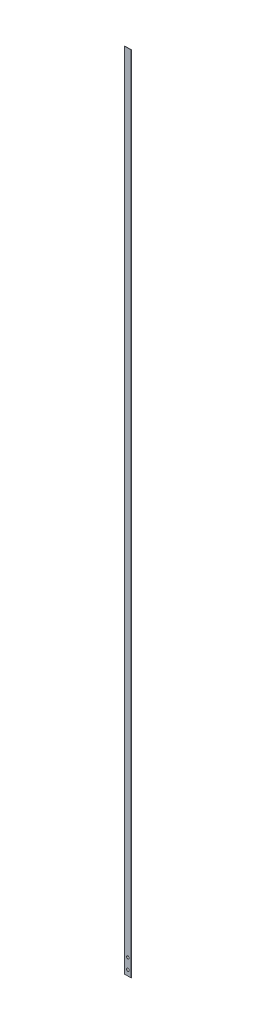
ISO-10303-21;
HEADER;
FILE_DESCRIPTION(('STEP AP214'),'2;1');
FILE_NAME('part.step','',(''),(''),'','','');
FILE_SCHEMA(('AUTOMOTIVE_DESIGN { 1 0 10303 214 1 1 1 1 }'));
ENDSEC;
DATA;
#1=APPLICATION_CONTEXT('core data for automotive mechanical design processes');
#2=APPLICATION_PROTOCOL_DEFINITION('international standard','automotive_design',2000,#1);
#3=PRODUCT_CONTEXT('',#1,'mechanical');
#4=PRODUCT('Part','Part','',(#3));
#5=PRODUCT_RELATED_PRODUCT_CATEGORY('part','',(#4));
#6=PRODUCT_DEFINITION_FORMATION('','',#4);
#7=PRODUCT_DEFINITION_CONTEXT('part definition',#1,'design');
#8=PRODUCT_DEFINITION('design','',#6,#7);
#9=PRODUCT_DEFINITION_SHAPE('','',#8);
#10=(LENGTH_UNIT() NAMED_UNIT(*) SI_UNIT(.MILLI.,.METRE.));
#11=(NAMED_UNIT(*) PLANE_ANGLE_UNIT() SI_UNIT($,.RADIAN.));
#12=(NAMED_UNIT(*) SI_UNIT($,.STERADIAN.) SOLID_ANGLE_UNIT());
#13=UNCERTAINTY_MEASURE_WITH_UNIT(LENGTH_MEASURE(1.E-05),#10,'distance_accuracy_value','');
#14=(GEOMETRIC_REPRESENTATION_CONTEXT(3) GLOBAL_UNCERTAINTY_ASSIGNED_CONTEXT((#13)) GLOBAL_UNIT_ASSIGNED_CONTEXT((#10,
#11,#12)) REPRESENTATION_CONTEXT('',''));
#15=CARTESIAN_POINT('',(0.,0.,0.));
#16=DIRECTION('',(0.,0.,1.));
#17=DIRECTION('',(1.,0.,0.));
#18=AXIS2_PLACEMENT_3D('',#15,#16,#17);
#19=CARTESIAN_POINT('',(2.50000000000001,600.,0.0999999999999998));
#20=DIRECTION('',(-1.,0.,0.));
#21=DIRECTION('',(0.,0.,1.));
#22=AXIS2_PLACEMENT_3D('',#19,#20,#21);
#23=PLANE('',#22);
#24=DIRECTION('',(0.,-1.,0.));
#25=VECTOR('',#24,1.);
#26=CARTESIAN_POINT('',(2.50000000000001,600.,0.0999999999999998));
#27=LINE('',#26,#25);
#28=CARTESIAN_POINT('',(2.50000000000001,600.,0.0999999999999998));
#29=VERTEX_POINT('',#28);
#30=CARTESIAN_POINT('',(2.50000000000001,2.,0.0999999999999998));
#31=VERTEX_POINT('',#30);
#32=EDGE_CURVE('E90',#29,#31,#27,.T.);
#33=ORIENTED_EDGE('',*,*,#32,.T.);
#34=DIRECTION('',(0.,0.,1.));
#35=VECTOR('',#34,1.);
#36=CARTESIAN_POINT('',(2.50000000000001,2.,-0.101));
#37=LINE('',#36,#35);
#38=CARTESIAN_POINT('',(2.50000000000001,2.,-0.1));
#39=VERTEX_POINT('',#38);
#40=EDGE_CURVE('E46',#39,#31,#37,.T.);
#41=ORIENTED_EDGE('',*,*,#40,.F.);
#42=DIRECTION('',(0.,-1.,0.));
#43=VECTOR('',#42,1.);
#44=CARTESIAN_POINT('',(2.50000000000001,600.,-0.1));
#45=LINE('',#44,#43);
#46=CARTESIAN_POINT('',(2.50000000000001,600.,-0.1));
#47=VERTEX_POINT('',#46);
#48=EDGE_CURVE('E11',#47,#39,#45,.T.);
#49=ORIENTED_EDGE('',*,*,#48,.F.);
#50=DIRECTION('',(0.,0.,-1.));
#51=VECTOR('',#50,1.);
#52=CARTESIAN_POINT('',(2.50000000000001,600.,0.0999999999999998));
#53=LINE('',#52,#51);
#54=EDGE_CURVE('E99',#29,#47,#53,.T.);
#55=ORIENTED_EDGE('',*,*,#54,.F.);
#56=EDGE_LOOP('',(#33,#41,#49,#55));
#57=FACE_BOUND('',#56,.T.);
#58=ADVANCED_FACE('F32',(#57),#23,.F.);
#59=CARTESIAN_POINT('',(-2.49999999999999,600.,-0.1));
#60=DIRECTION('',(0.,0.,1.));
#61=DIRECTION('',(1.,0.,0.));
#62=AXIS2_PLACEMENT_3D('',#59,#60,#61);
#63=PLANE('',#62);
#64=CARTESIAN_POINT('',(0.,6.,-0.1));
#65=DIRECTION('',(0.,0.,-1.));
#66=DIRECTION('',(-1.,0.,0.));
#67=AXIS2_PLACEMENT_3D('',#64,#65,#66);
#68=CIRCLE('',#67,1.);
#69=CARTESIAN_POINT('',(-1.,6.,-0.1));
#70=VERTEX_POINT('',#69);
#71=EDGE_CURVE('E87',#70,#70,#68,.T.);
#72=ORIENTED_EDGE('',*,*,#71,.F.);
#73=EDGE_LOOP('',(#72));
#74=FACE_BOUND('',#73,.T.);
#75=CARTESIAN_POINT('',(0.,14.,-0.1));
#76=DIRECTION('',(0.,0.,-1.));
#77=DIRECTION('',(-1.,0.,0.));
#78=AXIS2_PLACEMENT_3D('',#75,#76,#77);
#79=CIRCLE('',#78,1.);
#80=CARTESIAN_POINT('',(-1.,14.,-0.1));
#81=VERTEX_POINT('',#80);
#82=EDGE_CURVE('E102',#81,#81,#79,.T.);
#83=ORIENTED_EDGE('',*,*,#82,.F.);
#84=EDGE_LOOP('',(#83));
#85=FACE_BOUND('',#84,.T.);
#86=ORIENTED_EDGE('',*,*,#48,.T.);
#87=DIRECTION('',(1.,0.,0.));
#88=VECTOR('',#87,1.);
#89=CARTESIAN_POINT('',(-2.49999999999999,2.,-0.1));
#90=LINE('',#89,#88);
#91=CARTESIAN_POINT('',(-2.49999999999999,2.,-0.1));
#92=VERTEX_POINT('',#91);
#93=EDGE_CURVE('E78',#92,#39,#90,.T.);
#94=ORIENTED_EDGE('',*,*,#93,.F.);
#95=DIRECTION('',(0.,-1.,0.));
#96=VECTOR('',#95,1.);
#97=CARTESIAN_POINT('',(-2.49999999999999,600.,-0.1));
#98=LINE('',#97,#96);
#99=CARTESIAN_POINT('',(-2.49999999999999,600.,-0.1));
#100=VERTEX_POINT('',#99);
#101=EDGE_CURVE('E39',#100,#92,#98,.T.);
#102=ORIENTED_EDGE('',*,*,#101,.F.);
#103=DIRECTION('',(-1.,0.,0.));
#104=VECTOR('',#103,1.);
#105=CARTESIAN_POINT('',(-2.49999999999999,600.,-0.1));
#106=LINE('',#105,#104);
#107=EDGE_CURVE('E97',#47,#100,#106,.T.);
#108=ORIENTED_EDGE('',*,*,#107,.F.);
#109=EDGE_LOOP('',(#86,#94,#102,#108));
#110=FACE_BOUND('',#109,.T.);
#111=ADVANCED_FACE('F117',(#74,#85,#110),#63,.F.);
#112=CARTESIAN_POINT('',(-2.49999999999999,600.,0.0999999999999998));
#113=DIRECTION('',(1.,0.,0.));
#114=DIRECTION('',(0.,0.,-1.));
#115=AXIS2_PLACEMENT_3D('',#112,#113,#114);
#116=PLANE('',#115);
#117=ORIENTED_EDGE('',*,*,#101,.T.);
#118=DIRECTION('',(0.,0.,1.));
#119=VECTOR('',#118,1.);
#120=CARTESIAN_POINT('',(-2.49999999999999,2.,-0.101));
#121=LINE('',#120,#119);
#122=CARTESIAN_POINT('',(-2.49999999999999,2.,0.0999999999999998));
#123=VERTEX_POINT('',#122);
#124=EDGE_CURVE('E73',#92,#123,#121,.T.);
#125=ORIENTED_EDGE('',*,*,#124,.T.);
#126=DIRECTION('',(0.,-1.,0.));
#127=VECTOR('',#126,1.);
#128=CARTESIAN_POINT('',(-2.49999999999999,600.,0.0999999999999998));
#129=LINE('',#128,#127);
#130=CARTESIAN_POINT('',(-2.49999999999999,600.,0.0999999999999998));
#131=VERTEX_POINT('',#130);
#132=EDGE_CURVE('E85',#131,#123,#129,.T.);
#133=ORIENTED_EDGE('',*,*,#132,.F.);
#134=DIRECTION('',(0.,0.,1.));
#135=VECTOR('',#134,1.);
#136=CARTESIAN_POINT('',(-2.49999999999999,600.,0.0999999999999998));
#137=LINE('',#136,#135);
#138=EDGE_CURVE('E95',#100,#131,#137,.T.);
#139=ORIENTED_EDGE('',*,*,#138,.F.);
#140=EDGE_LOOP('',(#117,#125,#133,#139));
#141=FACE_BOUND('',#140,.T.);
#142=ADVANCED_FACE('F83',(#141),#116,.F.);
#143=CARTESIAN_POINT('',(-2.49999999999999,600.,0.0999999999999998));
#144=DIRECTION('',(0.,0.,-1.));
#145=DIRECTION('',(-1.,0.,0.));
#146=AXIS2_PLACEMENT_3D('',#143,#144,#145);
#147=PLANE('',#146);
#148=CARTESIAN_POINT('',(0.,6.,0.0999999999999998));
#149=DIRECTION('',(0.,0.,-1.));
#150=DIRECTION('',(-1.,0.,0.));
#151=AXIS2_PLACEMENT_3D('',#148,#149,#150);
#152=CIRCLE('',#151,1.);
#153=CARTESIAN_POINT('',(-1.,6.,0.0999999999999998));
#154=VERTEX_POINT('',#153);
#155=EDGE_CURVE('E105',#154,#154,#152,.T.);
#156=ORIENTED_EDGE('',*,*,#155,.T.);
#157=EDGE_LOOP('',(#156));
#158=FACE_BOUND('',#157,.T.);
#159=CARTESIAN_POINT('',(0.,14.,0.0999999999999998));
#160=DIRECTION('',(0.,0.,-1.));
#161=DIRECTION('',(-1.,0.,0.));
#162=AXIS2_PLACEMENT_3D('',#159,#160,#161);
#163=CIRCLE('',#162,1.);
#164=CARTESIAN_POINT('',(-1.,14.,0.0999999999999998));
#165=VERTEX_POINT('',#164);
#166=EDGE_CURVE('E101',#165,#165,#163,.T.);
#167=ORIENTED_EDGE('',*,*,#166,.T.);
#168=EDGE_LOOP('',(#167));
#169=FACE_BOUND('',#168,.T.);
#170=ORIENTED_EDGE('',*,*,#132,.T.);
#171=DIRECTION('',(-1.,0.,0.));
#172=VECTOR('',#171,1.);
#173=CARTESIAN_POINT('',(-2.49999999999999,2.,0.0999999999999998));
#174=LINE('',#173,#172);
#175=EDGE_CURVE('E70',#31,#123,#174,.T.);
#176=ORIENTED_EDGE('',*,*,#175,.F.);
#177=ORIENTED_EDGE('',*,*,#32,.F.);
#178=DIRECTION('',(1.,0.,0.));
#179=VECTOR('',#178,1.);
#180=CARTESIAN_POINT('',(-2.49999999999999,600.,0.0999999999999998));
#181=LINE('',#180,#179);
#182=EDGE_CURVE('E54',#131,#29,#181,.T.);
#183=ORIENTED_EDGE('',*,*,#182,.F.);
#184=EDGE_LOOP('',(#170,#176,#177,#183));
#185=FACE_BOUND('',#184,.T.);
#186=ADVANCED_FACE('F89',(#158,#169,#185),#147,.F.);
#187=CARTESIAN_POINT('',(2.50000000000001,600.,-0.1));
#188=DIRECTION('',(0.,-1.,0.));
#189=DIRECTION('',(0.,0.,-1.));
#190=AXIS2_PLACEMENT_3D('',#187,#188,#189);
#191=PLANE('',#190);
#192=ORIENTED_EDGE('',*,*,#54,.T.);
#193=ORIENTED_EDGE('',*,*,#107,.T.);
#194=ORIENTED_EDGE('',*,*,#138,.T.);
#195=ORIENTED_EDGE('',*,*,#182,.T.);
#196=EDGE_LOOP('',(#192,#193,#194,#195));
#197=FACE_BOUND('',#196,.T.);
#198=ADVANCED_FACE('F118',(#197),#191,.F.);
#199=CARTESIAN_POINT('',(0.,14.,0.0999999999999998));
#200=DIRECTION('',(0.,0.,-1.));
#201=DIRECTION('',(-1.,0.,0.));
#202=AXIS2_PLACEMENT_3D('',#199,#200,#201);
#203=CYLINDRICAL_SURFACE('',#202,1.);
#204=ORIENTED_EDGE('',*,*,#166,.F.);
#205=EDGE_LOOP('',(#204));
#206=FACE_BOUND('',#205,.T.);
#207=ORIENTED_EDGE('',*,*,#82,.T.);
#208=EDGE_LOOP('',(#207));
#209=FACE_BOUND('',#208,.T.);
#210=ADVANCED_FACE('F120',(#206,#209),#203,.F.);
#211=CARTESIAN_POINT('',(0.,6.,0.0999999999999998));
#212=DIRECTION('',(0.,0.,-1.));
#213=DIRECTION('',(-1.,0.,0.));
#214=AXIS2_PLACEMENT_3D('',#211,#212,#213);
#215=CYLINDRICAL_SURFACE('',#214,1.);
#216=ORIENTED_EDGE('',*,*,#155,.F.);
#217=EDGE_LOOP('',(#216));
#218=FACE_BOUND('',#217,.T.);
#219=ORIENTED_EDGE('',*,*,#71,.T.);
#220=EDGE_LOOP('',(#219));
#221=FACE_BOUND('',#220,.T.);
#222=ADVANCED_FACE('F126',(#218,#221),#215,.F.);
#223=CARTESIAN_POINT('',(-2.49999999999999,2.,-0.101));
#224=DIRECTION('',(0.,1.,0.));
#225=DIRECTION('',(-1.,0.,0.));
#226=AXIS2_PLACEMENT_3D('',#223,#224,#225);
#227=PLANE('',#226);
#228=ORIENTED_EDGE('',*,*,#93,.T.);
#229=ORIENTED_EDGE('',*,*,#40,.T.);
#230=ORIENTED_EDGE('',*,*,#175,.T.);
#231=ORIENTED_EDGE('',*,*,#124,.F.);
#232=EDGE_LOOP('',(#228,#229,#230,#231));
#233=FACE_BOUND('',#232,.T.);
#234=ADVANCED_FACE('F72',(#233),#227,.F.);
#235=CLOSED_SHELL('',(#58,#111,#142,#186,#198,#210,#222,#234));
#236=MANIFOLD_SOLID_BREP('B2',#235);
#237=ADVANCED_BREP_SHAPE_REPRESENTATION('',(#18,#236),#14);
#238=SHAPE_DEFINITION_REPRESENTATION(#9,#237);
ENDSEC;
END-ISO-10303-21;
